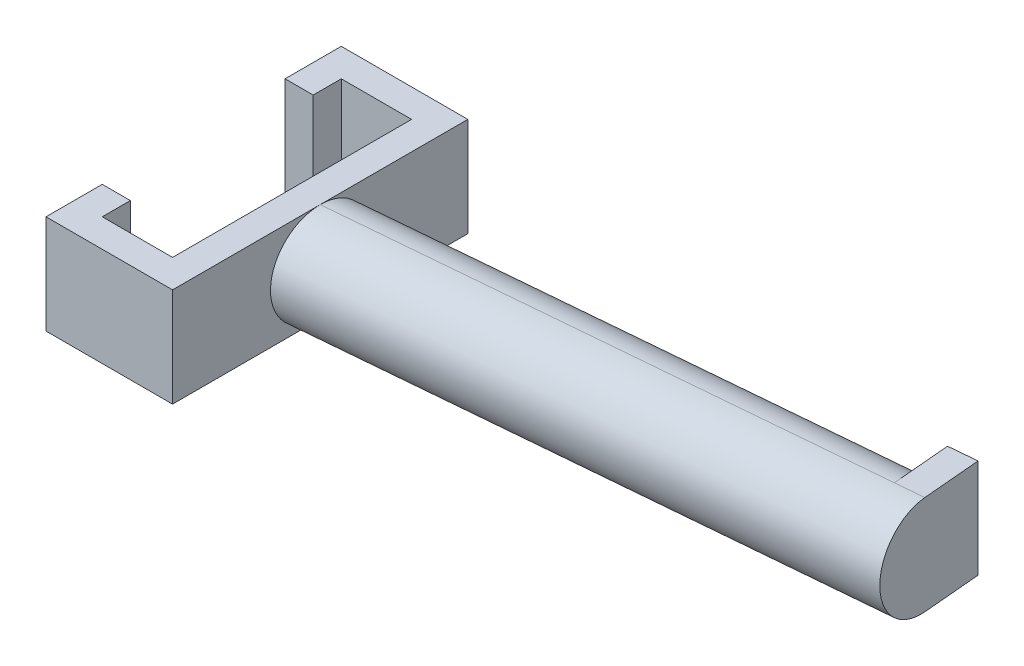
ISO-10303-21;
HEADER;
FILE_DESCRIPTION(('STEP AP214'),'2;1');
FILE_NAME('part.step','',(''),(''),'','','');
FILE_SCHEMA(('AUTOMOTIVE_DESIGN { 1 0 10303 214 1 1 1 1 }'));
ENDSEC;
DATA;
#1=APPLICATION_CONTEXT('core data for automotive mechanical design processes');
#2=APPLICATION_PROTOCOL_DEFINITION('international standard','automotive_design',2000,#1);
#3=PRODUCT_CONTEXT('',#1,'mechanical');
#4=PRODUCT('Part','Part','',(#3));
#5=PRODUCT_RELATED_PRODUCT_CATEGORY('part','',(#4));
#6=PRODUCT_DEFINITION_FORMATION('','',#4);
#7=PRODUCT_DEFINITION_CONTEXT('part definition',#1,'design');
#8=PRODUCT_DEFINITION('design','',#6,#7);
#9=PRODUCT_DEFINITION_SHAPE('','',#8);
#10=(LENGTH_UNIT() NAMED_UNIT(*) SI_UNIT(.MILLI.,.METRE.));
#11=(NAMED_UNIT(*) PLANE_ANGLE_UNIT() SI_UNIT($,.RADIAN.));
#12=(NAMED_UNIT(*) SI_UNIT($,.STERADIAN.) SOLID_ANGLE_UNIT());
#13=UNCERTAINTY_MEASURE_WITH_UNIT(LENGTH_MEASURE(1.E-05),#10,'distance_accuracy_value','');
#14=(GEOMETRIC_REPRESENTATION_CONTEXT(3) GLOBAL_UNCERTAINTY_ASSIGNED_CONTEXT((#13)) GLOBAL_UNIT_ASSIGNED_CONTEXT((#10,
#11,#12)) REPRESENTATION_CONTEXT('',''));
#15=CARTESIAN_POINT('',(0.,0.,0.));
#16=DIRECTION('',(0.,0.,1.));
#17=DIRECTION('',(1.,0.,0.));
#18=AXIS2_PLACEMENT_3D('',#15,#16,#17);
#19=CARTESIAN_POINT('',(-0.669359708161917,2.794,-7.65081647365142));
#20=DIRECTION('',(-0.996194698091745,0.,0.0871557427476621));
#21=DIRECTION('',(0.0871557427476621,0.,0.996194698091745));
#22=AXIS2_PLACEMENT_3D('',#19,#20,#21);
#23=CYLINDRICAL_SURFACE('',#22,2.794);
#24=DIRECTION('',(-0.996194698091745,0.,0.0871557427476621));
#25=VECTOR('',#24,1.);
#26=CARTESIAN_POINT('',(-0.669359708161917,5.588,-7.65081647365142));
#27=LINE('',#26,#25);
#28=CARTESIAN_POINT('',(36.9479594359553,5.588,-10.9419054509985));
#29=VERTEX_POINT('',#28);
#30=CARTESIAN_POINT('',(7.14375,5.588,-8.33437499999996));
#31=VERTEX_POINT('',#30);
#32=EDGE_CURVE('E201',#29,#31,#27,.T.);
#33=ORIENTED_EDGE('',*,*,#32,.F.);
#34=CARTESIAN_POINT('',(36.9479594359553,2.794,-10.9419054509985));
#35=DIRECTION('',(0.996194698091745,0.,-0.0871557427476625));
#36=DIRECTION('',(-0.0871557427476625,0.,-0.996194698091745));
#37=AXIS2_PLACEMENT_3D('',#34,#35,#36);
#38=CIRCLE('',#37,2.794);
#39=CARTESIAN_POINT('',(36.7044462907183,2.794,-13.7252734374669));
#40=VERTEX_POINT('',#39);
#41=EDGE_CURVE('E194',#29,#40,#38,.F.);
#42=ORIENTED_EDGE('',*,*,#41,.T.);
#43=DIRECTION('',(-0.996194698091745,0.,0.0871557427476621));
#44=VECTOR('',#43,1.);
#45=CARTESIAN_POINT('',(38.285905373939,2.794,-13.8636331790788));
#46=LINE('',#45,#44);
#47=CARTESIAN_POINT('',(7.14375,2.794,-11.1390476260961));
#48=VERTEX_POINT('',#47);
#49=EDGE_CURVE('E36',#48,#40,#46,.F.);
#50=ORIENTED_EDGE('',*,*,#49,.F.);
#51=CARTESIAN_POINT('',(7.14375,2.794,-8.33437499999996));
#52=DIRECTION('',(-1.,0.,0.));
#53=DIRECTION('',(0.,0.,1.));
#54=AXIS2_PLACEMENT_3D('',#51,#52,#53);
#55=ELLIPSE('',#54,2.80467262609611,2.794);
#56=EDGE_CURVE('E11',#31,#48,#55,.T.);
#57=ORIENTED_EDGE('',*,*,#56,.F.);
#58=EDGE_LOOP('',(#33,#42,#50,#57));
#59=FACE_BOUND('',#58,.T.);
#60=ADVANCED_FACE('F33',(#59),#23,.T.);
#61=CARTESIAN_POINT('',(38.5294185191759,2.794,-11.0802651926105));
#62=DIRECTION('',(0.996194698091745,0.,-0.0871557427476621));
#63=DIRECTION('',(-0.0871557427476621,0.,-0.996194698091745));
#64=AXIS2_PLACEMENT_3D('',#61,#62,#63);
#65=CYLINDRICAL_SURFACE('',#64,2.794);
#66=ORIENTED_EDGE('',*,*,#49,.T.);
#67=CARTESIAN_POINT('',(36.9479594359553,2.794,-10.9419054509985));
#68=DIRECTION('',(0.996194698091745,0.,-0.0871557427476625));
#69=DIRECTION('',(-0.0871557427476625,0.,-0.996194698091745));
#70=AXIS2_PLACEMENT_3D('',#67,#68,#69);
#71=CIRCLE('',#70,2.794);
#72=CARTESIAN_POINT('',(36.9479594359553,0.,-10.9419054509985));
#73=VERTEX_POINT('',#72);
#74=EDGE_CURVE('E180',#40,#73,#71,.F.);
#75=ORIENTED_EDGE('',*,*,#74,.T.);
#76=DIRECTION('',(-0.996194698091745,0.,0.0871557427476621));
#77=VECTOR('',#76,1.);
#78=CARTESIAN_POINT('',(38.5294185191759,0.,-11.0802651926105));
#79=LINE('',#78,#77);
#80=CARTESIAN_POINT('',(7.14375,0.,-8.33437499999996));
#81=VERTEX_POINT('',#80);
#82=EDGE_CURVE('E192',#81,#73,#79,.F.);
#83=ORIENTED_EDGE('',*,*,#82,.F.);
#84=CARTESIAN_POINT('',(7.14375,2.794,-8.33437499999996));
#85=DIRECTION('',(-1.,0.,0.));
#86=DIRECTION('',(0.,0.,-1.));
#87=AXIS2_PLACEMENT_3D('',#84,#85,#86);
#88=ELLIPSE('',#87,2.80467262609611,2.794);
#89=EDGE_CURVE('E280',#48,#81,#88,.T.);
#90=ORIENTED_EDGE('',*,*,#89,.F.);
#91=EDGE_LOOP('',(#66,#75,#83,#90));
#92=FACE_BOUND('',#91,.T.);
#93=ADVANCED_FACE('F190',(#92),#65,.T.);
#94=CARTESIAN_POINT('',(0.,5.588,0.));
#95=DIRECTION('',(1.,0.,0.));
#96=DIRECTION('',(0.,0.,-1.));
#97=AXIS2_PLACEMENT_3D('',#94,#95,#96);
#98=PLANE('',#97);
#99=DIRECTION('',(0.,0.,1.));
#100=VECTOR('',#99,1.);
#101=CARTESIAN_POINT('',(0.,0.,0.));
#102=LINE('',#101,#100);
#103=CARTESIAN_POINT('',(0.,0.,-3.175));
#104=VERTEX_POINT('',#103);
#105=CARTESIAN_POINT('',(0.,0.,0.));
#106=VERTEX_POINT('',#105);
#107=EDGE_CURVE('E205',#104,#106,#102,.T.);
#108=ORIENTED_EDGE('',*,*,#107,.T.);
#109=DIRECTION('',(0.,-1.,0.));
#110=VECTOR('',#109,1.);
#111=CARTESIAN_POINT('',(0.,5.588,0.));
#112=LINE('',#111,#110);
#113=CARTESIAN_POINT('',(0.,5.588,0.));
#114=VERTEX_POINT('',#113);
#115=EDGE_CURVE('E274',#114,#106,#112,.T.);
#116=ORIENTED_EDGE('',*,*,#115,.F.);
#117=DIRECTION('',(0.,0.,1.));
#118=VECTOR('',#117,1.);
#119=CARTESIAN_POINT('',(0.,5.588,0.));
#120=LINE('',#119,#118);
#121=CARTESIAN_POINT('',(0.,5.588,-3.175));
#122=VERTEX_POINT('',#121);
#123=EDGE_CURVE('E241',#122,#114,#120,.T.);
#124=ORIENTED_EDGE('',*,*,#123,.F.);
#125=DIRECTION('',(0.,-1.,0.));
#126=VECTOR('',#125,1.);
#127=CARTESIAN_POINT('',(0.,5.588,-3.175));
#128=LINE('',#127,#126);
#129=EDGE_CURVE('E242',#122,#104,#128,.T.);
#130=ORIENTED_EDGE('',*,*,#129,.T.);
#131=EDGE_LOOP('',(#108,#116,#124,#130));
#132=FACE_BOUND('',#131,.T.);
#133=ADVANCED_FACE('F338',(#132),#98,.F.);
#134=CARTESIAN_POINT('',(0.,5.588,0.));
#135=DIRECTION('',(0.,0.,-1.));
#136=DIRECTION('',(-1.,0.,0.));
#137=AXIS2_PLACEMENT_3D('',#134,#135,#136);
#138=PLANE('',#137);
#139=DIRECTION('',(1.,0.,0.));
#140=VECTOR('',#139,1.);
#141=CARTESIAN_POINT('',(0.,0.,0.));
#142=LINE('',#141,#140);
#143=CARTESIAN_POINT('',(7.14375,0.,0.));
#144=VERTEX_POINT('',#143);
#145=EDGE_CURVE('E207',#106,#144,#142,.T.);
#146=ORIENTED_EDGE('',*,*,#145,.T.);
#147=DIRECTION('',(0.,-1.,0.));
#148=VECTOR('',#147,1.);
#149=CARTESIAN_POINT('',(7.14375,5.588,0.));
#150=LINE('',#149,#148);
#151=CARTESIAN_POINT('',(7.14375,5.588,0.));
#152=VERTEX_POINT('',#151);
#153=EDGE_CURVE('E271',#152,#144,#150,.T.);
#154=ORIENTED_EDGE('',*,*,#153,.F.);
#155=DIRECTION('',(1.,0.,0.));
#156=VECTOR('',#155,1.);
#157=CARTESIAN_POINT('',(0.,5.588,0.));
#158=LINE('',#157,#156);
#159=EDGE_CURVE('E339',#114,#152,#158,.T.);
#160=ORIENTED_EDGE('',*,*,#159,.F.);
#161=ORIENTED_EDGE('',*,*,#115,.T.);
#162=EDGE_LOOP('',(#146,#154,#160,#161));
#163=FACE_BOUND('',#162,.T.);
#164=ADVANCED_FACE('F348',(#163),#138,.F.);
#165=CARTESIAN_POINT('',(7.14375,5.588,0.));
#166=DIRECTION('',(-1.,0.,0.));
#167=DIRECTION('',(0.,0.,1.));
#168=AXIS2_PLACEMENT_3D('',#165,#166,#167);
#169=PLANE('',#168);
#170=DIRECTION('',(0.,0.,-1.));
#171=VECTOR('',#170,1.);
#172=CARTESIAN_POINT('',(7.14375,0.,0.));
#173=LINE('',#172,#171);
#174=EDGE_CURVE('E213',#144,#81,#173,.T.);
#175=ORIENTED_EDGE('',*,*,#174,.T.);
#176=CARTESIAN_POINT('',(7.14375,2.794,-8.33437499999996));
#177=DIRECTION('',(-1.,0.,0.));
#178=DIRECTION('',(0.,0.,1.));
#179=AXIS2_PLACEMENT_3D('',#176,#177,#178);
#180=ELLIPSE('',#179,2.80467262609611,2.794);
#181=CARTESIAN_POINT('',(7.14375,2.794,-5.52970237390385));
#182=VERTEX_POINT('',#181);
#183=EDGE_CURVE('E200',#81,#182,#180,.T.);
#184=ORIENTED_EDGE('',*,*,#183,.T.);
#185=CARTESIAN_POINT('',(7.14375,2.794,-8.33437499999996));
#186=DIRECTION('',(-1.,0.,0.));
#187=DIRECTION('',(0.,0.,-1.));
#188=AXIS2_PLACEMENT_3D('',#185,#186,#187);
#189=ELLIPSE('',#188,2.80467262609611,2.794);
#190=EDGE_CURVE('E41',#182,#31,#189,.T.);
#191=ORIENTED_EDGE('',*,*,#190,.T.);
#192=DIRECTION('',(0.,0.,-1.));
#193=VECTOR('',#192,1.);
#194=CARTESIAN_POINT('',(7.14375,5.588,0.));
#195=LINE('',#194,#193);
#196=EDGE_CURVE('E287',#152,#31,#195,.T.);
#197=ORIENTED_EDGE('',*,*,#196,.F.);
#198=ORIENTED_EDGE('',*,*,#153,.T.);
#199=EDGE_LOOP('',(#175,#184,#191,#197,#198));
#200=FACE_BOUND('',#199,.T.);
#201=ADVANCED_FACE('F285',(#200),#169,.F.);
#202=CARTESIAN_POINT('',(38.7729316644129,5.588,-8.29689720614212));
#203=DIRECTION('',(-0.996194698091745,0.,0.0871557427476625));
#204=DIRECTION('',(0.0871557427476625,0.,0.996194698091745));
#205=AXIS2_PLACEMENT_3D('',#202,#203,#204);
#206=PLANE('',#205);
#207=DIRECTION('',(0.0871557427476627,0.,0.996194698091745));
#208=VECTOR('',#207,1.);
#209=CARTESIAN_POINT('',(38.5294185191759,5.588,-11.0802651926105));
#210=LINE('',#209,#208);
#211=CARTESIAN_POINT('',(38.2416302566232,5.588,-14.3697000857094));
#212=VERTEX_POINT('',#211);
#213=CARTESIAN_POINT('',(38.5294185191759,5.588,-11.0802651926105));
#214=VERTEX_POINT('',#213);
#215=EDGE_CURVE('E185',#212,#214,#210,.T.);
#216=ORIENTED_EDGE('',*,*,#215,.T.);
#217=CARTESIAN_POINT('',(38.5294185191759,2.794,-11.0802651926105));
#218=DIRECTION('',(-0.996194698091745,0.,0.0871557427476625));
#219=DIRECTION('',(0.0871557427476625,0.,0.996194698091745));
#220=AXIS2_PLACEMENT_3D('',#217,#218,#219);
#221=CIRCLE('',#220,2.794);
#222=CARTESIAN_POINT('',(38.5294185191759,0.,-11.0802651926105));
#223=VERTEX_POINT('',#222);
#224=EDGE_CURVE('E277',#214,#223,#221,.F.);
#225=ORIENTED_EDGE('',*,*,#224,.T.);
#226=DIRECTION('',(-0.0871557427476627,0.,-0.996194698091745));
#227=VECTOR('',#226,1.);
#228=CARTESIAN_POINT('',(38.2416302566232,0.,-14.3697000857094));
#229=LINE('',#228,#227);
#230=CARTESIAN_POINT('',(38.2416302566232,0.,-14.3697000857094));
#231=VERTEX_POINT('',#230);
#232=EDGE_CURVE('E170',#223,#231,#229,.T.);
#233=ORIENTED_EDGE('',*,*,#232,.T.);
#234=DIRECTION('',(0.,1.,0.));
#235=VECTOR('',#234,1.);
#236=CARTESIAN_POINT('',(38.2416302566232,5.588,-14.3697000857094));
#237=LINE('',#236,#235);
#238=EDGE_CURVE('E546',#231,#212,#237,.T.);
#239=ORIENTED_EDGE('',*,*,#238,.T.);
#240=EDGE_LOOP('',(#216,#225,#233,#239));
#241=FACE_BOUND('',#240,.T.);
#242=ADVANCED_FACE('F394',(#241),#206,.F.);
#243=CARTESIAN_POINT('',(7.14375,5.588,-11.1390476260961));
#244=DIRECTION('',(-1.,0.,0.));
#245=DIRECTION('',(0.,0.,1.));
#246=AXIS2_PLACEMENT_3D('',#243,#244,#245);
#247=PLANE('',#246);
#248=DIRECTION('',(0.,0.,-1.));
#249=VECTOR('',#248,1.);
#250=CARTESIAN_POINT('',(7.14375,0.,-11.1390476260961));
#251=LINE('',#250,#249);
#252=CARTESIAN_POINT('',(7.14375,0.,-16.6687499999999));
#253=VERTEX_POINT('',#252);
#254=EDGE_CURVE('E221',#81,#253,#251,.T.);
#255=ORIENTED_EDGE('',*,*,#254,.T.);
#256=DIRECTION('',(0.,-1.,0.));
#257=VECTOR('',#256,1.);
#258=CARTESIAN_POINT('',(7.14375,5.588,-16.6687499999999));
#259=LINE('',#258,#257);
#260=CARTESIAN_POINT('',(7.14375,5.588,-16.6687499999999));
#261=VERTEX_POINT('',#260);
#262=EDGE_CURVE('E268',#261,#253,#259,.T.);
#263=ORIENTED_EDGE('',*,*,#262,.F.);
#264=DIRECTION('',(0.,0.,-1.));
#265=VECTOR('',#264,1.);
#266=CARTESIAN_POINT('',(7.14375,5.588,-11.1390476260961));
#267=LINE('',#266,#265);
#268=EDGE_CURVE('E345',#31,#261,#267,.T.);
#269=ORIENTED_EDGE('',*,*,#268,.F.);
#270=ORIENTED_EDGE('',*,*,#56,.T.);
#271=ORIENTED_EDGE('',*,*,#89,.T.);
#272=EDGE_LOOP('',(#255,#263,#269,#270,#271));
#273=FACE_BOUND('',#272,.T.);
#274=ADVANCED_FACE('F290',(#273),#247,.F.);
#275=CARTESIAN_POINT('',(7.14375,5.588,-16.6687499999999));
#276=DIRECTION('',(0.,0.,1.));
#277=DIRECTION('',(1.,0.,0.));
#278=AXIS2_PLACEMENT_3D('',#275,#276,#277);
#279=PLANE('',#278);
#280=DIRECTION('',(-1.,0.,0.));
#281=VECTOR('',#280,1.);
#282=CARTESIAN_POINT('',(7.14375,0.,-16.6687499999999));
#283=LINE('',#282,#281);
#284=CARTESIAN_POINT('',(0.,0.,-16.6687499999999));
#285=VERTEX_POINT('',#284);
#286=EDGE_CURVE('E223',#253,#285,#283,.T.);
#287=ORIENTED_EDGE('',*,*,#286,.T.);
#288=DIRECTION('',(0.,-1.,0.));
#289=VECTOR('',#288,1.);
#290=CARTESIAN_POINT('',(0.,5.588,-16.6687499999999));
#291=LINE('',#290,#289);
#292=CARTESIAN_POINT('',(0.,5.588,-16.6687499999999));
#293=VERTEX_POINT('',#292);
#294=EDGE_CURVE('E265',#293,#285,#291,.T.);
#295=ORIENTED_EDGE('',*,*,#294,.F.);
#296=DIRECTION('',(-1.,0.,0.));
#297=VECTOR('',#296,1.);
#298=CARTESIAN_POINT('',(7.14375,5.588,-16.6687499999999));
#299=LINE('',#298,#297);
#300=EDGE_CURVE('E299',#261,#293,#299,.T.);
#301=ORIENTED_EDGE('',*,*,#300,.F.);
#302=ORIENTED_EDGE('',*,*,#262,.T.);
#303=EDGE_LOOP('',(#287,#295,#301,#302));
#304=FACE_BOUND('',#303,.T.);
#305=ADVANCED_FACE('F297',(#304),#279,.F.);
#306=CARTESIAN_POINT('',(0.,5.588,-16.6687499999999));
#307=DIRECTION('',(1.,0.,0.));
#308=DIRECTION('',(0.,0.,-1.));
#309=AXIS2_PLACEMENT_3D('',#306,#307,#308);
#310=PLANE('',#309);
#311=DIRECTION('',(0.,0.,1.));
#312=VECTOR('',#311,1.);
#313=CARTESIAN_POINT('',(0.,0.,-16.6687499999999));
#314=LINE('',#313,#312);
#315=CARTESIAN_POINT('',(0.,0.,-13.4937499999999));
#316=VERTEX_POINT('',#315);
#317=EDGE_CURVE('E225',#285,#316,#314,.T.);
#318=ORIENTED_EDGE('',*,*,#317,.T.);
#319=DIRECTION('',(0.,-1.,0.));
#320=VECTOR('',#319,1.);
#321=CARTESIAN_POINT('',(0.,5.588,-13.4937499999999));
#322=LINE('',#321,#320);
#323=CARTESIAN_POINT('',(0.,5.588,-13.4937499999999));
#324=VERTEX_POINT('',#323);
#325=EDGE_CURVE('E262',#324,#316,#322,.T.);
#326=ORIENTED_EDGE('',*,*,#325,.F.);
#327=DIRECTION('',(0.,0.,1.));
#328=VECTOR('',#327,1.);
#329=CARTESIAN_POINT('',(0.,5.588,-16.6687499999999));
#330=LINE('',#329,#328);
#331=EDGE_CURVE('E316',#293,#324,#330,.T.);
#332=ORIENTED_EDGE('',*,*,#331,.F.);
#333=ORIENTED_EDGE('',*,*,#294,.T.);
#334=EDGE_LOOP('',(#318,#326,#332,#333));
#335=FACE_BOUND('',#334,.T.);
#336=ADVANCED_FACE('F306',(#335),#310,.F.);
#337=CARTESIAN_POINT('',(0.,5.588,-13.4937499999999));
#338=DIRECTION('',(0.,0.,-1.));
#339=DIRECTION('',(-1.,0.,0.));
#340=AXIS2_PLACEMENT_3D('',#337,#338,#339);
#341=PLANE('',#340);
#342=DIRECTION('',(1.,0.,0.));
#343=VECTOR('',#342,1.);
#344=CARTESIAN_POINT('',(0.,0.,-13.4937499999999));
#345=LINE('',#344,#343);
#346=CARTESIAN_POINT('',(1.5875,0.,-13.4937499999999));
#347=VERTEX_POINT('',#346);
#348=EDGE_CURVE('E227',#316,#347,#345,.T.);
#349=ORIENTED_EDGE('',*,*,#348,.T.);
#350=DIRECTION('',(0.,-1.,0.));
#351=VECTOR('',#350,1.);
#352=CARTESIAN_POINT('',(1.5875,5.588,-13.4937499999999));
#353=LINE('',#352,#351);
#354=CARTESIAN_POINT('',(1.5875,5.588,-13.4937499999999));
#355=VERTEX_POINT('',#354);
#356=EDGE_CURVE('E259',#355,#347,#353,.T.);
#357=ORIENTED_EDGE('',*,*,#356,.F.);
#358=DIRECTION('',(1.,0.,0.));
#359=VECTOR('',#358,1.);
#360=CARTESIAN_POINT('',(0.,5.588,-13.4937499999999));
#361=LINE('',#360,#359);
#362=EDGE_CURVE('E312',#324,#355,#361,.T.);
#363=ORIENTED_EDGE('',*,*,#362,.F.);
#364=ORIENTED_EDGE('',*,*,#325,.T.);
#365=EDGE_LOOP('',(#349,#357,#363,#364));
#366=FACE_BOUND('',#365,.T.);
#367=ADVANCED_FACE('F310',(#366),#341,.F.);
#368=CARTESIAN_POINT('',(1.5875,5.588,-13.4937499999999));
#369=DIRECTION('',(-1.,0.,0.));
#370=DIRECTION('',(0.,0.,1.));
#371=AXIS2_PLACEMENT_3D('',#368,#369,#370);
#372=PLANE('',#371);
#373=DIRECTION('',(0.,0.,-1.));
#374=VECTOR('',#373,1.);
#375=CARTESIAN_POINT('',(1.5875,0.,-13.4937499999999));
#376=LINE('',#375,#374);
#377=CARTESIAN_POINT('',(1.5875,0.,-15.0812499999999));
#378=VERTEX_POINT('',#377);
#379=EDGE_CURVE('E229',#347,#378,#376,.T.);
#380=ORIENTED_EDGE('',*,*,#379,.T.);
#381=DIRECTION('',(0.,-1.,0.));
#382=VECTOR('',#381,1.);
#383=CARTESIAN_POINT('',(1.5875,5.588,-15.0812499999999));
#384=LINE('',#383,#382);
#385=CARTESIAN_POINT('',(1.5875,5.588,-15.0812499999999));
#386=VERTEX_POINT('',#385);
#387=EDGE_CURVE('E256',#386,#378,#384,.T.);
#388=ORIENTED_EDGE('',*,*,#387,.F.);
#389=DIRECTION('',(0.,0.,-1.));
#390=VECTOR('',#389,1.);
#391=CARTESIAN_POINT('',(1.5875,5.588,-13.4937499999999));
#392=LINE('',#391,#390);
#393=EDGE_CURVE('E315',#355,#386,#392,.T.);
#394=ORIENTED_EDGE('',*,*,#393,.F.);
#395=ORIENTED_EDGE('',*,*,#356,.T.);
#396=EDGE_LOOP('',(#380,#388,#394,#395));
#397=FACE_BOUND('',#396,.T.);
#398=ADVANCED_FACE('F369',(#397),#372,.F.);
#399=CARTESIAN_POINT('',(1.5875,5.588,-15.0812499999999));
#400=DIRECTION('',(0.,0.,-1.));
#401=DIRECTION('',(-1.,0.,0.));
#402=AXIS2_PLACEMENT_3D('',#399,#400,#401);
#403=PLANE('',#402);
#404=DIRECTION('',(1.,0.,0.));
#405=VECTOR('',#404,1.);
#406=CARTESIAN_POINT('',(1.5875,0.,-15.0812499999999));
#407=LINE('',#406,#405);
#408=CARTESIAN_POINT('',(5.55625,0.,-15.0812499999999));
#409=VERTEX_POINT('',#408);
#410=EDGE_CURVE('E231',#378,#409,#407,.T.);
#411=ORIENTED_EDGE('',*,*,#410,.T.);
#412=DIRECTION('',(0.,-1.,0.));
#413=VECTOR('',#412,1.);
#414=CARTESIAN_POINT('',(5.55625,5.588,-15.0812499999999));
#415=LINE('',#414,#413);
#416=CARTESIAN_POINT('',(5.55625,5.588,-15.0812499999999));
#417=VERTEX_POINT('',#416);
#418=EDGE_CURVE('E253',#417,#409,#415,.T.);
#419=ORIENTED_EDGE('',*,*,#418,.F.);
#420=DIRECTION('',(1.,0.,0.));
#421=VECTOR('',#420,1.);
#422=CARTESIAN_POINT('',(1.5875,5.588,-15.0812499999999));
#423=LINE('',#422,#421);
#424=EDGE_CURVE('E318',#386,#417,#423,.T.);
#425=ORIENTED_EDGE('',*,*,#424,.F.);
#426=ORIENTED_EDGE('',*,*,#387,.T.);
#427=EDGE_LOOP('',(#411,#419,#425,#426));
#428=FACE_BOUND('',#427,.T.);
#429=ADVANCED_FACE('F365',(#428),#403,.F.);
#430=CARTESIAN_POINT('',(5.55625,5.588,-15.0812499999999));
#431=DIRECTION('',(1.,0.,0.));
#432=DIRECTION('',(0.,0.,-1.));
#433=AXIS2_PLACEMENT_3D('',#430,#431,#432);
#434=PLANE('',#433);
#435=DIRECTION('',(0.,0.,1.));
#436=VECTOR('',#435,1.);
#437=CARTESIAN_POINT('',(5.55625,0.,-15.0812499999999));
#438=LINE('',#437,#436);
#439=CARTESIAN_POINT('',(5.55625,0.,-1.58749999999995));
#440=VERTEX_POINT('',#439);
#441=EDGE_CURVE('E233',#409,#440,#438,.T.);
#442=ORIENTED_EDGE('',*,*,#441,.T.);
#443=DIRECTION('',(0.,-1.,0.));
#444=VECTOR('',#443,1.);
#445=CARTESIAN_POINT('',(5.55625,5.588,-1.58749999999995));
#446=LINE('',#445,#444);
#447=CARTESIAN_POINT('',(5.55625,5.588,-1.58749999999995));
#448=VERTEX_POINT('',#447);
#449=EDGE_CURVE('E250',#448,#440,#446,.T.);
#450=ORIENTED_EDGE('',*,*,#449,.F.);
#451=DIRECTION('',(0.,0.,1.));
#452=VECTOR('',#451,1.);
#453=CARTESIAN_POINT('',(5.55625,5.588,-15.0812499999999));
#454=LINE('',#453,#452);
#455=EDGE_CURVE('E324',#417,#448,#454,.T.);
#456=ORIENTED_EDGE('',*,*,#455,.F.);
#457=ORIENTED_EDGE('',*,*,#418,.T.);
#458=EDGE_LOOP('',(#442,#450,#456,#457));
#459=FACE_BOUND('',#458,.T.);
#460=ADVANCED_FACE('F361',(#459),#434,.F.);
#461=CARTESIAN_POINT('',(5.55625,5.588,-1.58749999999995));
#462=DIRECTION('',(0.,0.,1.));
#463=DIRECTION('',(1.,0.,0.));
#464=AXIS2_PLACEMENT_3D('',#461,#462,#463);
#465=PLANE('',#464);
#466=DIRECTION('',(-1.,0.,0.));
#467=VECTOR('',#466,1.);
#468=CARTESIAN_POINT('',(5.55625,0.,-1.58749999999995));
#469=LINE('',#468,#467);
#470=CARTESIAN_POINT('',(1.5875,0.,-1.5875));
#471=VERTEX_POINT('',#470);
#472=EDGE_CURVE('E235',#440,#471,#469,.T.);
#473=ORIENTED_EDGE('',*,*,#472,.T.);
#474=DIRECTION('',(0.,-1.,0.));
#475=VECTOR('',#474,1.);
#476=CARTESIAN_POINT('',(1.5875,5.588,-1.5875));
#477=LINE('',#476,#475);
#478=CARTESIAN_POINT('',(1.5875,5.588,-1.5875));
#479=VERTEX_POINT('',#478);
#480=EDGE_CURVE('E247',#479,#471,#477,.T.);
#481=ORIENTED_EDGE('',*,*,#480,.F.);
#482=DIRECTION('',(-1.,0.,0.));
#483=VECTOR('',#482,1.);
#484=CARTESIAN_POINT('',(5.55625,5.588,-1.58749999999995));
#485=LINE('',#484,#483);
#486=EDGE_CURVE('E326',#448,#479,#485,.T.);
#487=ORIENTED_EDGE('',*,*,#486,.F.);
#488=ORIENTED_EDGE('',*,*,#449,.T.);
#489=EDGE_LOOP('',(#473,#481,#487,#488));
#490=FACE_BOUND('',#489,.T.);
#491=ADVANCED_FACE('F357',(#490),#465,.F.);
#492=CARTESIAN_POINT('',(1.5875,5.588,-3.175));
#493=DIRECTION('',(-1.,0.,0.));
#494=DIRECTION('',(0.,0.,1.));
#495=AXIS2_PLACEMENT_3D('',#492,#493,#494);
#496=PLANE('',#495);
#497=DIRECTION('',(0.,0.,-1.));
#498=VECTOR('',#497,1.);
#499=CARTESIAN_POINT('',(1.5875,0.,-3.175));
#500=LINE('',#499,#498);
#501=CARTESIAN_POINT('',(1.5875,0.,-3.175));
#502=VERTEX_POINT('',#501);
#503=EDGE_CURVE('E237',#471,#502,#500,.T.);
#504=ORIENTED_EDGE('',*,*,#503,.T.);
#505=DIRECTION('',(0.,-1.,0.));
#506=VECTOR('',#505,1.);
#507=CARTESIAN_POINT('',(1.5875,5.588,-3.175));
#508=LINE('',#507,#506);
#509=CARTESIAN_POINT('',(1.5875,5.588,-3.175));
#510=VERTEX_POINT('',#509);
#511=EDGE_CURVE('E244',#510,#502,#508,.T.);
#512=ORIENTED_EDGE('',*,*,#511,.F.);
#513=DIRECTION('',(0.,0.,-1.));
#514=VECTOR('',#513,1.);
#515=CARTESIAN_POINT('',(1.5875,5.588,-3.175));
#516=LINE('',#515,#514);
#517=EDGE_CURVE('E327',#479,#510,#516,.T.);
#518=ORIENTED_EDGE('',*,*,#517,.F.);
#519=ORIENTED_EDGE('',*,*,#480,.T.);
#520=EDGE_LOOP('',(#504,#512,#518,#519));
#521=FACE_BOUND('',#520,.T.);
#522=ADVANCED_FACE('F353',(#521),#496,.F.);
#523=CARTESIAN_POINT('',(0.,5.588,-3.175));
#524=DIRECTION('',(0.,0.,1.));
#525=DIRECTION('',(1.,0.,0.));
#526=AXIS2_PLACEMENT_3D('',#523,#524,#525);
#527=PLANE('',#526);
#528=DIRECTION('',(-1.,0.,0.));
#529=VECTOR('',#528,1.);
#530=CARTESIAN_POINT('',(0.,0.,-3.175));
#531=LINE('',#530,#529);
#532=EDGE_CURVE('E239',#502,#104,#531,.T.);
#533=ORIENTED_EDGE('',*,*,#532,.T.);
#534=ORIENTED_EDGE('',*,*,#129,.F.);
#535=DIRECTION('',(-1.,0.,0.));
#536=VECTOR('',#535,1.);
#537=CARTESIAN_POINT('',(0.,5.588,-3.175));
#538=LINE('',#537,#536);
#539=EDGE_CURVE('E216',#510,#122,#538,.T.);
#540=ORIENTED_EDGE('',*,*,#539,.F.);
#541=ORIENTED_EDGE('',*,*,#511,.T.);
#542=EDGE_LOOP('',(#533,#534,#540,#541));
#543=FACE_BOUND('',#542,.T.);
#544=ADVANCED_FACE('F336',(#543),#527,.F.);
#545=CARTESIAN_POINT('',(0.,5.588,0.));
#546=DIRECTION('',(0.,-1.,0.));
#547=DIRECTION('',(0.,0.,-1.));
#548=AXIS2_PLACEMENT_3D('',#545,#546,#547);
#549=PLANE('',#548);
#550=ORIENTED_EDGE('',*,*,#196,.T.);
#551=ORIENTED_EDGE('',*,*,#268,.T.);
#552=ORIENTED_EDGE('',*,*,#300,.T.);
#553=ORIENTED_EDGE('',*,*,#331,.T.);
#554=ORIENTED_EDGE('',*,*,#362,.T.);
#555=ORIENTED_EDGE('',*,*,#393,.T.);
#556=ORIENTED_EDGE('',*,*,#424,.T.);
#557=ORIENTED_EDGE('',*,*,#455,.T.);
#558=ORIENTED_EDGE('',*,*,#486,.T.);
#559=ORIENTED_EDGE('',*,*,#517,.T.);
#560=ORIENTED_EDGE('',*,*,#539,.T.);
#561=ORIENTED_EDGE('',*,*,#123,.T.);
#562=ORIENTED_EDGE('',*,*,#159,.T.);
#563=EDGE_LOOP('',(#550,#551,#552,#553,#554,#555,#556,#557,#558,#559,#560,#561,#562));
#564=FACE_BOUND('',#563,.T.);
#565=ADVANCED_FACE('F333',(#564),#549,.F.);
#566=CARTESIAN_POINT('',(0.,0.,0.));
#567=DIRECTION('',(0.,-1.,0.));
#568=DIRECTION('',(0.,0.,-1.));
#569=AXIS2_PLACEMENT_3D('',#566,#567,#568);
#570=PLANE('',#569);
#571=ORIENTED_EDGE('',*,*,#254,.F.);
#572=ORIENTED_EDGE('',*,*,#174,.F.);
#573=ORIENTED_EDGE('',*,*,#145,.F.);
#574=ORIENTED_EDGE('',*,*,#107,.F.);
#575=ORIENTED_EDGE('',*,*,#532,.F.);
#576=ORIENTED_EDGE('',*,*,#503,.F.);
#577=ORIENTED_EDGE('',*,*,#472,.F.);
#578=ORIENTED_EDGE('',*,*,#441,.F.);
#579=ORIENTED_EDGE('',*,*,#410,.F.);
#580=ORIENTED_EDGE('',*,*,#379,.F.);
#581=ORIENTED_EDGE('',*,*,#348,.F.);
#582=ORIENTED_EDGE('',*,*,#317,.F.);
#583=ORIENTED_EDGE('',*,*,#286,.F.);
#584=EDGE_LOOP('',(#571,#572,#573,#574,#575,#576,#577,#578,#579,#580,#581,#582,#583));
#585=FACE_BOUND('',#584,.T.);
#586=ADVANCED_FACE('F301',(#585),#570,.T.);
#587=CARTESIAN_POINT('',(-0.669359708161917,2.794,-7.65081647365142));
#588=DIRECTION('',(0.996194698091745,0.,-0.0871557427476622));
#589=DIRECTION('',(-0.0871557427476622,0.,-0.996194698091745));
#590=AXIS2_PLACEMENT_3D('',#587,#588,#589);
#591=CYLINDRICAL_SURFACE('',#590,2.794);
#592=EDGE_CURVE('E203',#214,#29,#27,.T.);
#593=ORIENTED_EDGE('',*,*,#592,.T.);
#594=ORIENTED_EDGE('',*,*,#32,.T.);
#595=ORIENTED_EDGE('',*,*,#190,.F.);
#596=DIRECTION('',(0.996194698091745,0.,-0.0871557427476622));
#597=VECTOR('',#596,1.);
#598=CARTESIAN_POINT('',(7.14375,2.794,-5.52970237390385));
#599=LINE('',#598,#597);
#600=CARTESIAN_POINT('',(37.1914725811923,2.794,-8.15853746453021));
#601=VERTEX_POINT('',#600);
#602=EDGE_CURVE('E48',#601,#182,#599,.F.);
#603=ORIENTED_EDGE('',*,*,#602,.F.);
#604=ORIENTED_EDGE('',*,*,#602,.T.);
#605=ORIENTED_EDGE('',*,*,#183,.F.);
#606=ORIENTED_EDGE('',*,*,#82,.T.);
#607=DIRECTION('',(0.996194698091745,0.,-0.0871557427476625));
#608=VECTOR('',#607,1.);
#609=CARTESIAN_POINT('',(36.9479594359553,0.,-10.9419054509985));
#610=LINE('',#609,#608);
#611=EDGE_CURVE('E165',#73,#223,#610,.T.);
#612=ORIENTED_EDGE('',*,*,#611,.T.);
#613=ORIENTED_EDGE('',*,*,#224,.F.);
#614=EDGE_LOOP('',(#593,#594,#595,#603,#604,#605,#606,#612,#613));
#615=FACE_BOUND('',#614,.T.);
#616=ADVANCED_FACE('F198',(#615),#591,.T.);
#617=CARTESIAN_POINT('',(36.9479594359553,5.588,-10.9419054509985));
#618=DIRECTION('',(0.,1.,0.));
#619=DIRECTION('',(0.,0.,1.));
#620=AXIS2_PLACEMENT_3D('',#617,#618,#619);
#621=PLANE('',#620);
#622=ORIENTED_EDGE('',*,*,#215,.F.);
#623=DIRECTION('',(0.996194698091745,0.,-0.0871557427476625));
#624=VECTOR('',#623,1.);
#625=CARTESIAN_POINT('',(36.6601711734025,5.588,-14.2313403440975));
#626=LINE('',#625,#624);
#627=CARTESIAN_POINT('',(36.6601711734025,5.588,-14.2313403440975));
#628=VERTEX_POINT('',#627);
#629=EDGE_CURVE('E195',#628,#212,#626,.T.);
#630=ORIENTED_EDGE('',*,*,#629,.F.);
#631=DIRECTION('',(0.0871557427476627,0.,0.996194698091745));
#632=VECTOR('',#631,1.);
#633=CARTESIAN_POINT('',(36.9479594359553,5.588,-10.9419054509985));
#634=LINE('',#633,#632);
#635=EDGE_CURVE('E174',#628,#29,#634,.T.);
#636=ORIENTED_EDGE('',*,*,#635,.T.);
#637=ORIENTED_EDGE('',*,*,#592,.F.);
#638=EDGE_LOOP('',(#622,#630,#636,#637));
#639=FACE_BOUND('',#638,.T.);
#640=ADVANCED_FACE('F388',(#639),#621,.T.);
#641=CARTESIAN_POINT('',(36.6601711734025,5.588,-14.2313403440975));
#642=DIRECTION('',(-0.0871557427476625,0.,-0.996194698091745));
#643=DIRECTION('',(-0.996194698091745,0.,0.0871557427476625));
#644=AXIS2_PLACEMENT_3D('',#641,#642,#643);
#645=PLANE('',#644);
#646=ORIENTED_EDGE('',*,*,#238,.F.);
#647=DIRECTION('',(0.996194698091745,0.,-0.0871557427476625));
#648=VECTOR('',#647,1.);
#649=CARTESIAN_POINT('',(36.6601711734025,0.,-14.2313403440975));
#650=LINE('',#649,#648);
#651=CARTESIAN_POINT('',(36.6601711734025,0.,-14.2313403440975));
#652=VERTEX_POINT('',#651);
#653=EDGE_CURVE('E173',#652,#231,#650,.T.);
#654=ORIENTED_EDGE('',*,*,#653,.F.);
#655=DIRECTION('',(0.,1.,0.));
#656=VECTOR('',#655,1.);
#657=CARTESIAN_POINT('',(36.6601711734025,5.588,-14.2313403440975));
#658=LINE('',#657,#656);
#659=EDGE_CURVE('E184',#652,#628,#658,.T.);
#660=ORIENTED_EDGE('',*,*,#659,.T.);
#661=ORIENTED_EDGE('',*,*,#629,.T.);
#662=EDGE_LOOP('',(#646,#654,#660,#661));
#663=FACE_BOUND('',#662,.T.);
#664=ADVANCED_FACE('F514',(#663),#645,.T.);
#665=CARTESIAN_POINT('',(36.6601711734025,0.,-14.2313403440975));
#666=DIRECTION('',(0.,-1.,0.));
#667=DIRECTION('',(0.,0.,-1.));
#668=AXIS2_PLACEMENT_3D('',#665,#666,#667);
#669=PLANE('',#668);
#670=ORIENTED_EDGE('',*,*,#232,.F.);
#671=ORIENTED_EDGE('',*,*,#611,.F.);
#672=DIRECTION('',(-0.0871557427476627,0.,-0.996194698091745));
#673=VECTOR('',#672,1.);
#674=CARTESIAN_POINT('',(36.6601711734025,0.,-14.2313403440975));
#675=LINE('',#674,#673);
#676=EDGE_CURVE('E168',#73,#652,#675,.T.);
#677=ORIENTED_EDGE('',*,*,#676,.T.);
#678=ORIENTED_EDGE('',*,*,#653,.T.);
#679=EDGE_LOOP('',(#670,#671,#677,#678));
#680=FACE_BOUND('',#679,.T.);
#681=ADVANCED_FACE('F167',(#680),#669,.T.);
#682=CARTESIAN_POINT('',(36.9479594359553,2.794,-10.9419054509986));
#683=DIRECTION('',(0.996194698091745,0.,-0.0871557427476625));
#684=DIRECTION('',(-0.0871557427476625,0.,-0.996194698091745));
#685=AXIS2_PLACEMENT_3D('',#682,#683,#684);
#686=PLANE('',#685);
#687=ORIENTED_EDGE('',*,*,#41,.F.);
#688=ORIENTED_EDGE('',*,*,#635,.F.);
#689=ORIENTED_EDGE('',*,*,#659,.F.);
#690=ORIENTED_EDGE('',*,*,#676,.F.);
#691=ORIENTED_EDGE('',*,*,#74,.F.);
#692=EDGE_LOOP('',(#687,#688,#689,#690,#691));
#693=FACE_BOUND('',#692,.T.);
#694=ADVANCED_FACE('F179',(#693),#686,.F.);
#695=CLOSED_SHELL('',(#60,#93,#133,#164,#201,#242,#274,#305,#336,#367,#398,#429,#460,#491,#522,
#544,#565,#586,#616,#640,#664,#681,#694));
#696=MANIFOLD_SOLID_BREP('B2',#695);
#697=ADVANCED_BREP_SHAPE_REPRESENTATION('',(#18,#696),#14);
#698=SHAPE_DEFINITION_REPRESENTATION(#9,#697);
ENDSEC;
END-ISO-10303-21;
